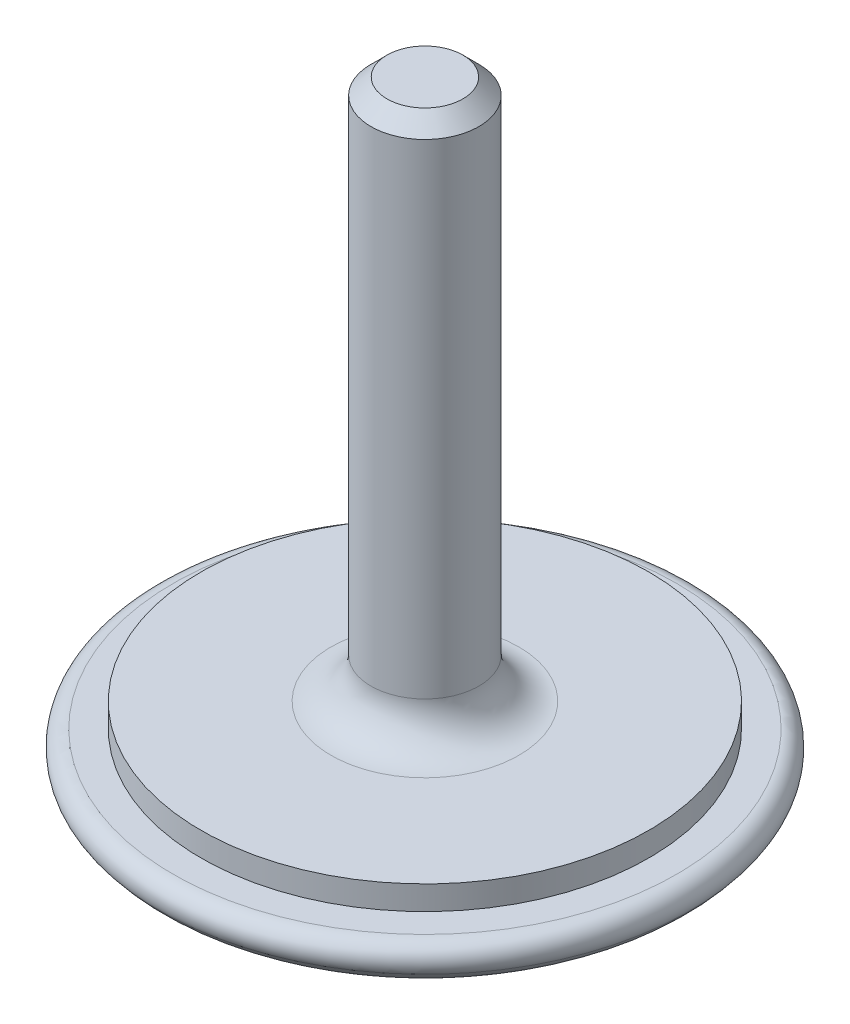
ISO-10303-21;
HEADER;
FILE_DESCRIPTION(('STEP AP214'),'2;1');
FILE_NAME('part.step','',(''),(''),'','','');
FILE_SCHEMA(('AUTOMOTIVE_DESIGN { 1 0 10303 214 1 1 1 1 }'));
ENDSEC;
DATA;
#1=APPLICATION_CONTEXT('core data for automotive mechanical design processes');
#2=APPLICATION_PROTOCOL_DEFINITION('international standard','automotive_design',2000,#1);
#3=PRODUCT_CONTEXT('',#1,'mechanical');
#4=PRODUCT('Part','Part','',(#3));
#5=PRODUCT_RELATED_PRODUCT_CATEGORY('part','',(#4));
#6=PRODUCT_DEFINITION_FORMATION('','',#4);
#7=PRODUCT_DEFINITION_CONTEXT('part definition',#1,'design');
#8=PRODUCT_DEFINITION('design','',#6,#7);
#9=PRODUCT_DEFINITION_SHAPE('','',#8);
#10=(LENGTH_UNIT() NAMED_UNIT(*) SI_UNIT(.MILLI.,.METRE.));
#11=(NAMED_UNIT(*) PLANE_ANGLE_UNIT() SI_UNIT($,.RADIAN.));
#12=(NAMED_UNIT(*) SI_UNIT($,.STERADIAN.) SOLID_ANGLE_UNIT());
#13=UNCERTAINTY_MEASURE_WITH_UNIT(LENGTH_MEASURE(1.E-05),#10,'distance_accuracy_value','');
#14=(GEOMETRIC_REPRESENTATION_CONTEXT(3) GLOBAL_UNCERTAINTY_ASSIGNED_CONTEXT((#13)) GLOBAL_UNIT_ASSIGNED_CONTEXT((#10,
#11,#12)) REPRESENTATION_CONTEXT('',''));
#15=CARTESIAN_POINT('',(0.,0.,0.));
#16=DIRECTION('',(0.,0.,1.));
#17=DIRECTION('',(1.,0.,0.));
#18=AXIS2_PLACEMENT_3D('',#15,#16,#17);
#19=CARTESIAN_POINT('',(0.,8.5,0.));
#20=DIRECTION('',(0.,-1.,0.));
#21=DIRECTION('',(0.,0.,-1.));
#22=AXIS2_PLACEMENT_3D('',#19,#20,#21);
#23=TOROIDAL_SURFACE('',#22,5.875,2.5);
#24=CARTESIAN_POINT('',(0.,8.5,0.));
#25=DIRECTION('',(0.,-1.,0.));
#26=DIRECTION('',(0.,0.,-1.));
#27=AXIS2_PLACEMENT_3D('',#24,#25,#26);
#28=CIRCLE('',#27,3.375);
#29=CARTESIAN_POINT('',(0.,8.5,-3.375));
#30=VERTEX_POINT('',#29);
#31=EDGE_CURVE('E79',#30,#30,#28,.T.);
#32=ORIENTED_EDGE('',*,*,#31,.T.);
#33=EDGE_LOOP('',(#32));
#34=FACE_BOUND('',#33,.T.);
#35=CARTESIAN_POINT('',(0.,6.,0.));
#36=DIRECTION('',(0.,-1.,0.));
#37=DIRECTION('',(0.,0.,-1.));
#38=AXIS2_PLACEMENT_3D('',#35,#36,#37);
#39=CIRCLE('',#38,5.875);
#40=CARTESIAN_POINT('',(0.,6.,-5.875));
#41=VERTEX_POINT('',#40);
#42=EDGE_CURVE('E10',#41,#41,#39,.T.);
#43=ORIENTED_EDGE('',*,*,#42,.F.);
#44=EDGE_LOOP('',(#43));
#45=FACE_BOUND('',#44,.T.);
#46=ADVANCED_FACE('F39',(#34,#45),#23,.F.);
#47=CARTESIAN_POINT('',(14.,6.,0.));
#48=DIRECTION('',(0.,1.,0.));
#49=DIRECTION('',(0.,0.,1.));
#50=AXIS2_PLACEMENT_3D('',#47,#48,#49);
#51=PLANE('',#50);
#52=ORIENTED_EDGE('',*,*,#42,.T.);
#53=EDGE_LOOP('',(#52));
#54=FACE_BOUND('',#53,.T.);
#55=CARTESIAN_POINT('',(0.,6.,0.));
#56=DIRECTION('',(0.,-1.,0.));
#57=DIRECTION('',(0.,0.,-1.));
#58=AXIS2_PLACEMENT_3D('',#55,#56,#57);
#59=CIRCLE('',#58,14.);
#60=CARTESIAN_POINT('',(0.,6.,-14.));
#61=VERTEX_POINT('',#60);
#62=EDGE_CURVE('E45',#61,#61,#59,.T.);
#63=ORIENTED_EDGE('',*,*,#62,.F.);
#64=EDGE_LOOP('',(#63));
#65=FACE_BOUND('',#64,.T.);
#66=ADVANCED_FACE('F97',(#54,#65),#51,.T.);
#67=CARTESIAN_POINT('',(0.,0.,0.));
#68=DIRECTION('',(0.,-1.,0.));
#69=DIRECTION('',(0.,0.,-1.));
#70=AXIS2_PLACEMENT_3D('',#67,#68,#69);
#71=CYLINDRICAL_SURFACE('',#70,14.);
#72=ORIENTED_EDGE('',*,*,#62,.T.);
#73=EDGE_LOOP('',(#72));
#74=FACE_BOUND('',#73,.T.);
#75=CARTESIAN_POINT('',(0.,4.5,0.));
#76=DIRECTION('',(0.,-1.,0.));
#77=DIRECTION('',(0.,0.,-1.));
#78=AXIS2_PLACEMENT_3D('',#75,#76,#77);
#79=CIRCLE('',#78,14.);
#80=CARTESIAN_POINT('',(0.,4.5,-14.));
#81=VERTEX_POINT('',#80);
#82=EDGE_CURVE('E49',#81,#81,#79,.T.);
#83=ORIENTED_EDGE('',*,*,#82,.F.);
#84=EDGE_LOOP('',(#83));
#85=FACE_BOUND('',#84,.T.);
#86=ADVANCED_FACE('F101',(#74,#85),#71,.T.);
#87=CARTESIAN_POINT('',(14.,4.5,0.));
#88=DIRECTION('',(0.,1.,0.));
#89=DIRECTION('',(0.,0.,1.));
#90=AXIS2_PLACEMENT_3D('',#87,#88,#89);
#91=PLANE('',#90);
#92=ORIENTED_EDGE('',*,*,#82,.T.);
#93=EDGE_LOOP('',(#92));
#94=FACE_BOUND('',#93,.T.);
#95=CARTESIAN_POINT('',(0.,4.5,0.));
#96=DIRECTION('',(0.,-1.,0.));
#97=DIRECTION('',(0.,0.,-1.));
#98=AXIS2_PLACEMENT_3D('',#95,#96,#97);
#99=CIRCLE('',#98,15.75);
#100=CARTESIAN_POINT('',(0.,4.5,-15.75));
#101=VERTEX_POINT('',#100);
#102=EDGE_CURVE('E53',#101,#101,#99,.T.);
#103=ORIENTED_EDGE('',*,*,#102,.F.);
#104=EDGE_LOOP('',(#103));
#105=FACE_BOUND('',#104,.T.);
#106=ADVANCED_FACE('F105',(#94,#105),#91,.T.);
#107=CARTESIAN_POINT('',(0.,3.5,0.));
#108=DIRECTION('',(0.,-1.,0.));
#109=DIRECTION('',(0.,0.,-1.));
#110=AXIS2_PLACEMENT_3D('',#107,#108,#109);
#111=TOROIDAL_SURFACE('',#110,15.75,1.);
#112=ORIENTED_EDGE('',*,*,#102,.T.);
#113=EDGE_LOOP('',(#112));
#114=FACE_BOUND('',#113,.T.);
#115=CARTESIAN_POINT('',(0.,2.91691370496097,0.));
#116=DIRECTION('',(0.,-1.,0.));
#117=DIRECTION('',(0.,0.,-1.));
#118=AXIS2_PLACEMENT_3D('',#115,#116,#117);
#119=CIRCLE('',#118,16.5624102242941);
#120=CARTESIAN_POINT('',(0.,2.91691370496097,-16.5624102242941));
#121=VERTEX_POINT('',#120);
#122=EDGE_CURVE('E58',#121,#121,#119,.T.);
#123=ORIENTED_EDGE('',*,*,#122,.F.);
#124=EDGE_LOOP('',(#123));
#125=FACE_BOUND('',#124,.T.);
#126=ADVANCED_FACE('F111',(#114,#125),#111,.T.);
#127=CARTESIAN_POINT('',(0.,4.66617259007806,0.));
#128=DIRECTION('',(0.,-1.,0.));
#129=DIRECTION('',(0.,0.,-1.));
#130=AXIS2_PLACEMENT_3D('',#127,#128,#129);
#131=TOROIDAL_SURFACE('',#130,14.1251795514117,3.);
#132=ORIENTED_EDGE('',*,*,#122,.T.);
#133=EDGE_LOOP('',(#132));
#134=FACE_BOUND('',#133,.T.);
#135=CARTESIAN_POINT('',(0.,1.74306239572235,0.));
#136=DIRECTION('',(0.,-1.,0.));
#137=DIRECTION('',(0.,0.,-1.));
#138=AXIS2_PLACEMENT_3D('',#135,#136,#137);
#139=CIRCLE('',#138,14.8000327144433);
#140=CARTESIAN_POINT('',(0.,1.74306239572235,-14.8000327144433));
#141=VERTEX_POINT('',#140);
#142=EDGE_CURVE('E61',#141,#141,#139,.T.);
#143=ORIENTED_EDGE('',*,*,#142,.F.);
#144=EDGE_LOOP('',(#143));
#145=FACE_BOUND('',#144,.T.);
#146=ADVANCED_FACE('F115',(#134,#145),#131,.T.);
#147=CARTESIAN_POINT('',(0.,0.256299352147646,0.));
#148=DIRECTION('',(0.,1.,0.));
#149=DIRECTION('',(0.,0.,1.));
#150=AXIS2_PLACEMENT_3D('',#147,#148,#149);
#151=CONICAL_SURFACE('',#150,8.36015446042219,1.34390352403563);
#152=ORIENTED_EDGE('',*,*,#142,.T.);
#153=EDGE_LOOP('',(#152));
#154=FACE_BOUND('',#153,.T.);
#155=CARTESIAN_POINT('',(0.,0.256299352147646,0.));
#156=DIRECTION('',(0.,-1.,0.));
#157=DIRECTION('',(0.,0.,-1.));
#158=AXIS2_PLACEMENT_3D('',#155,#156,#157);
#159=CIRCLE('',#158,8.36015446042219);
#160=CARTESIAN_POINT('',(0.,0.256299352147646,-8.36015446042219));
#161=VERTEX_POINT('',#160);
#162=EDGE_CURVE('E64',#161,#161,#159,.T.);
#163=ORIENTED_EDGE('',*,*,#162,.F.);
#164=EDGE_LOOP('',(#163));
#165=FACE_BOUND('',#164,.T.);
#166=ADVANCED_FACE('F119',(#154,#165),#151,.T.);
#167=CARTESIAN_POINT('',(0.,10.,0.));
#168=DIRECTION('',(0.,-1.,0.));
#169=DIRECTION('',(0.,0.,-1.));
#170=AXIS2_PLACEMENT_3D('',#167,#168,#169);
#171=DEGENERATE_TOROIDAL_SURFACE('',#170,6.11064391698354,10.,.T.);
#172=ORIENTED_EDGE('',*,*,#162,.T.);
#173=EDGE_LOOP('',(#172));
#174=FACE_BOUND('',#173,.T.);
#175=CARTESIAN_POINT('',(0.,0.,0.));
#176=DIRECTION('',(0.,-1.,0.));
#177=DIRECTION('',(0.,0.,-1.));
#178=AXIS2_PLACEMENT_3D('',#175,#176,#177);
#179=CIRCLE('',#178,6.11064391698354);
#180=CARTESIAN_POINT('',(0.,0.,-6.11064391698354));
#181=VERTEX_POINT('',#180);
#182=EDGE_CURVE('E67',#181,#181,#179,.T.);
#183=ORIENTED_EDGE('',*,*,#182,.F.);
#184=EDGE_LOOP('',(#183));
#185=FACE_BOUND('',#184,.T.);
#186=ADVANCED_FACE('F123',(#174,#185),#171,.T.);
#187=CARTESIAN_POINT('',(3.,0.,0.));
#188=DIRECTION('',(0.,-1.,0.));
#189=DIRECTION('',(0.,0.,-1.));
#190=AXIS2_PLACEMENT_3D('',#187,#188,#189);
#191=PLANE('',#190);
#192=ORIENTED_EDGE('',*,*,#182,.T.);
#193=EDGE_LOOP('',(#192));
#194=FACE_BOUND('',#193,.T.);
#195=CARTESIAN_POINT('',(0.,0.,0.));
#196=DIRECTION('',(0.,-1.,0.));
#197=DIRECTION('',(0.,0.,-1.));
#198=AXIS2_PLACEMENT_3D('',#195,#196,#197);
#199=CIRCLE('',#198,3.);
#200=CARTESIAN_POINT('',(0.,0.,-3.));
#201=VERTEX_POINT('',#200);
#202=EDGE_CURVE('E70',#201,#201,#199,.T.);
#203=ORIENTED_EDGE('',*,*,#202,.F.);
#204=EDGE_LOOP('',(#203));
#205=FACE_BOUND('',#204,.T.);
#206=ADVANCED_FACE('F127',(#194,#205),#191,.T.);
#207=CARTESIAN_POINT('',(0.,-4.,0.));
#208=DIRECTION('',(0.,-1.,0.));
#209=DIRECTION('',(-1.,0.,0.));
#210=AXIS2_PLACEMENT_3D('',#207,#208,#209);
#211=SPHERICAL_SURFACE('',#210,5.);
#212=ORIENTED_EDGE('',*,*,#202,.T.);
#213=EDGE_LOOP('',(#212));
#214=FACE_BOUND('',#213,.T.);
#215=ADVANCED_FACE('F131',(#214),#211,.F.);
#216=CARTESIAN_POINT('',(2.37500000000001,39.8,0.));
#217=DIRECTION('',(0.,1.,0.));
#218=DIRECTION('',(0.,0.,1.));
#219=AXIS2_PLACEMENT_3D('',#216,#217,#218);
#220=PLANE('',#219);
#221=CARTESIAN_POINT('',(0.,39.8,0.));
#222=DIRECTION('',(0.,-1.,0.));
#223=DIRECTION('',(0.,0.,-1.));
#224=AXIS2_PLACEMENT_3D('',#221,#222,#223);
#225=CIRCLE('',#224,2.37500000000001);
#226=CARTESIAN_POINT('',(0.,39.8,-2.37500000000001));
#227=VERTEX_POINT('',#226);
#228=EDGE_CURVE('E73',#227,#227,#225,.T.);
#229=ORIENTED_EDGE('',*,*,#228,.F.);
#230=EDGE_LOOP('',(#229));
#231=FACE_BOUND('',#230,.T.);
#232=ADVANCED_FACE('F93',(#231),#220,.T.);
#233=CARTESIAN_POINT('',(0.,38.8,0.));
#234=DIRECTION('',(0.,-1.,0.));
#235=DIRECTION('',(0.,0.,-1.));
#236=AXIS2_PLACEMENT_3D('',#233,#234,#235);
#237=CONICAL_SURFACE('',#236,3.375,0.785398163397443);
#238=ORIENTED_EDGE('',*,*,#228,.T.);
#239=EDGE_LOOP('',(#238));
#240=FACE_BOUND('',#239,.T.);
#241=CARTESIAN_POINT('',(0.,38.8,0.));
#242=DIRECTION('',(0.,-1.,0.));
#243=DIRECTION('',(0.,0.,-1.));
#244=AXIS2_PLACEMENT_3D('',#241,#242,#243);
#245=CIRCLE('',#244,3.375);
#246=CARTESIAN_POINT('',(0.,38.8,-3.375));
#247=VERTEX_POINT('',#246);
#248=EDGE_CURVE('E76',#247,#247,#245,.T.);
#249=ORIENTED_EDGE('',*,*,#248,.F.);
#250=EDGE_LOOP('',(#249));
#251=FACE_BOUND('',#250,.T.);
#252=ADVANCED_FACE('F87',(#240,#251),#237,.T.);
#253=CARTESIAN_POINT('',(0.,0.,0.));
#254=DIRECTION('',(0.,-1.,0.));
#255=DIRECTION('',(0.,0.,-1.));
#256=AXIS2_PLACEMENT_3D('',#253,#254,#255);
#257=CYLINDRICAL_SURFACE('',#256,3.375);
#258=ORIENTED_EDGE('',*,*,#248,.T.);
#259=EDGE_LOOP('',(#258));
#260=FACE_BOUND('',#259,.T.);
#261=ORIENTED_EDGE('',*,*,#31,.F.);
#262=EDGE_LOOP('',(#261));
#263=FACE_BOUND('',#262,.T.);
#264=ADVANCED_FACE('F85',(#260,#263),#257,.T.);
#265=CLOSED_SHELL('',(#46,#66,#86,#106,#126,#146,#166,#186,#206,#215,#232,#252,#264));
#266=MANIFOLD_SOLID_BREP('B2',#265);
#267=ADVANCED_BREP_SHAPE_REPRESENTATION('',(#18,#266),#14);
#268=SHAPE_DEFINITION_REPRESENTATION(#9,#267);
ENDSEC;
END-ISO-10303-21;
